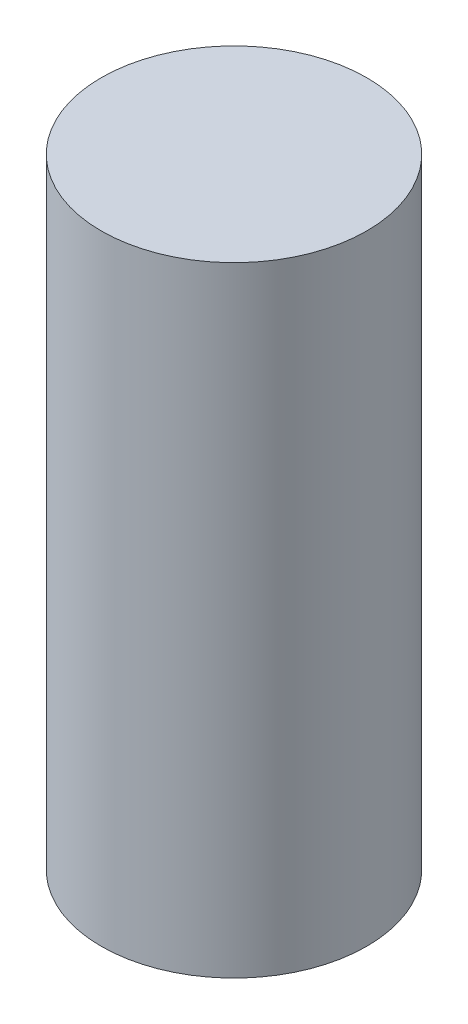
ISO-10303-21;
HEADER;
FILE_DESCRIPTION(('STEP AP214'),'2;1');
FILE_NAME('part.step','',(''),(''),'','','');
FILE_SCHEMA(('AUTOMOTIVE_DESIGN { 1 0 10303 214 1 1 1 1 }'));
ENDSEC;
DATA;
#1=APPLICATION_CONTEXT('core data for automotive mechanical design processes');
#2=APPLICATION_PROTOCOL_DEFINITION('international standard','automotive_design',2000,#1);
#3=PRODUCT_CONTEXT('',#1,'mechanical');
#4=PRODUCT('Part','Part','',(#3));
#5=PRODUCT_RELATED_PRODUCT_CATEGORY('part','',(#4));
#6=PRODUCT_DEFINITION_FORMATION('','',#4);
#7=PRODUCT_DEFINITION_CONTEXT('part definition',#1,'design');
#8=PRODUCT_DEFINITION('design','',#6,#7);
#9=PRODUCT_DEFINITION_SHAPE('','',#8);
#10=(LENGTH_UNIT() NAMED_UNIT(*) SI_UNIT(.MILLI.,.METRE.));
#11=(NAMED_UNIT(*) PLANE_ANGLE_UNIT() SI_UNIT($,.RADIAN.));
#12=(NAMED_UNIT(*) SI_UNIT($,.STERADIAN.) SOLID_ANGLE_UNIT());
#13=UNCERTAINTY_MEASURE_WITH_UNIT(LENGTH_MEASURE(1.E-05),#10,'distance_accuracy_value','');
#14=(GEOMETRIC_REPRESENTATION_CONTEXT(3) GLOBAL_UNCERTAINTY_ASSIGNED_CONTEXT((#13)) GLOBAL_UNIT_ASSIGNED_CONTEXT((#10,
#11,#12)) REPRESENTATION_CONTEXT('',''));
#15=CARTESIAN_POINT('',(0.,0.,0.));
#16=DIRECTION('',(0.,0.,1.));
#17=DIRECTION('',(1.,0.,0.));
#18=AXIS2_PLACEMENT_3D('',#15,#16,#17);
#19=CARTESIAN_POINT('',(0.,14.,0.));
#20=DIRECTION('',(0.,-1.,0.));
#21=DIRECTION('',(0.,0.,-1.));
#22=AXIS2_PLACEMENT_3D('',#19,#20,#21);
#23=CYLINDRICAL_SURFACE('',#22,3.);
#24=CARTESIAN_POINT('',(0.,14.,0.));
#25=DIRECTION('',(0.,1.,0.));
#26=DIRECTION('',(0.,0.,1.));
#27=AXIS2_PLACEMENT_3D('',#24,#25,#26);
#28=CIRCLE('',#27,3.);
#29=CARTESIAN_POINT('',(0.,14.,3.));
#30=VERTEX_POINT('',#29);
#31=EDGE_CURVE('E10',#30,#30,#28,.T.);
#32=ORIENTED_EDGE('',*,*,#31,.F.);
#33=EDGE_LOOP('',(#32));
#34=FACE_BOUND('',#33,.T.);
#35=CARTESIAN_POINT('',(0.,0.,0.));
#36=DIRECTION('',(0.,1.,0.));
#37=DIRECTION('',(0.,0.,1.));
#38=AXIS2_PLACEMENT_3D('',#35,#36,#37);
#39=CIRCLE('',#38,3.);
#40=CARTESIAN_POINT('',(0.,0.,3.));
#41=VERTEX_POINT('',#40);
#42=EDGE_CURVE('E40',#41,#41,#39,.T.);
#43=ORIENTED_EDGE('',*,*,#42,.T.);
#44=EDGE_LOOP('',(#43));
#45=FACE_BOUND('',#44,.T.);
#46=ADVANCED_FACE('F37',(#34,#45),#23,.T.);
#47=CARTESIAN_POINT('',(0.,14.,0.));
#48=DIRECTION('',(0.,1.,0.));
#49=DIRECTION('',(0.,0.,1.));
#50=AXIS2_PLACEMENT_3D('',#47,#48,#49);
#51=PLANE('',#50);
#52=ORIENTED_EDGE('',*,*,#31,.T.);
#53=EDGE_LOOP('',(#52));
#54=FACE_BOUND('',#53,.T.);
#55=ADVANCED_FACE('F54',(#54),#51,.T.);
#56=CARTESIAN_POINT('',(0.,0.,0.));
#57=DIRECTION('',(0.,1.,0.));
#58=DIRECTION('',(0.,0.,1.));
#59=AXIS2_PLACEMENT_3D('',#56,#57,#58);
#60=PLANE('',#59);
#61=ORIENTED_EDGE('',*,*,#42,.F.);
#62=EDGE_LOOP('',(#61));
#63=FACE_BOUND('',#62,.T.);
#64=ADVANCED_FACE('F52',(#63),#60,.F.);
#65=CLOSED_SHELL('',(#46,#55,#64));
#66=MANIFOLD_SOLID_BREP('B2',#65);
#67=ADVANCED_BREP_SHAPE_REPRESENTATION('',(#18,#66),#14);
#68=SHAPE_DEFINITION_REPRESENTATION(#9,#67);
ENDSEC;
END-ISO-10303-21;
